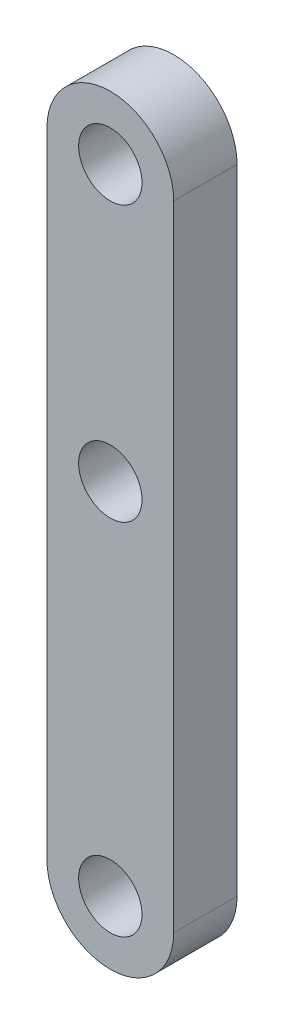
ISO-10303-21;
HEADER;
FILE_DESCRIPTION(('STEP AP214'),'2;1');
FILE_NAME('part.step','',(''),(''),'','','');
FILE_SCHEMA(('AUTOMOTIVE_DESIGN { 1 0 10303 214 1 1 1 1 }'));
ENDSEC;
DATA;
#1=APPLICATION_CONTEXT('core data for automotive mechanical design processes');
#2=APPLICATION_PROTOCOL_DEFINITION('international standard','automotive_design',2000,#1);
#3=PRODUCT_CONTEXT('',#1,'mechanical');
#4=PRODUCT('Part','Part','',(#3));
#5=PRODUCT_RELATED_PRODUCT_CATEGORY('part','',(#4));
#6=PRODUCT_DEFINITION_FORMATION('','',#4);
#7=PRODUCT_DEFINITION_CONTEXT('part definition',#1,'design');
#8=PRODUCT_DEFINITION('design','',#6,#7);
#9=PRODUCT_DEFINITION_SHAPE('','',#8);
#10=(LENGTH_UNIT() NAMED_UNIT(*) SI_UNIT(.MILLI.,.METRE.));
#11=(NAMED_UNIT(*) PLANE_ANGLE_UNIT() SI_UNIT($,.RADIAN.));
#12=(NAMED_UNIT(*) SI_UNIT($,.STERADIAN.) SOLID_ANGLE_UNIT());
#13=UNCERTAINTY_MEASURE_WITH_UNIT(LENGTH_MEASURE(1.E-05),#10,'distance_accuracy_value','');
#14=(GEOMETRIC_REPRESENTATION_CONTEXT(3) GLOBAL_UNCERTAINTY_ASSIGNED_CONTEXT((#13)) GLOBAL_UNIT_ASSIGNED_CONTEXT((#10,
#11,#12)) REPRESENTATION_CONTEXT('',''));
#15=CARTESIAN_POINT('',(0.,0.,0.));
#16=DIRECTION('',(0.,0.,1.));
#17=DIRECTION('',(1.,0.,0.));
#18=AXIS2_PLACEMENT_3D('',#15,#16,#17);
#19=CARTESIAN_POINT('',(0.,-30.,-3.));
#20=DIRECTION('',(0.,0.,1.));
#21=DIRECTION('',(-1.,0.,0.));
#22=AXIS2_PLACEMENT_3D('',#19,#20,#21);
#23=PLANE('',#22);
#24=DIRECTION('',(0.,1.,0.));
#25=VECTOR('',#24,1.);
#26=CARTESIAN_POINT('',(3.,-8.,-3.));
#27=LINE('',#26,#25);
#28=CARTESIAN_POINT('',(3.,-30.,-3.));
#29=VERTEX_POINT('',#28);
#30=CARTESIAN_POINT('',(3.,0.,-3.));
#31=VERTEX_POINT('',#30);
#32=EDGE_CURVE('E89',#29,#31,#27,.T.);
#33=ORIENTED_EDGE('',*,*,#32,.F.);
#34=CARTESIAN_POINT('',(0.,-30.,-3.));
#35=DIRECTION('',(0.,0.,1.));
#36=DIRECTION('',(-1.,0.,0.));
#37=AXIS2_PLACEMENT_3D('',#34,#35,#36);
#38=CIRCLE('',#37,3.);
#39=CARTESIAN_POINT('',(-3.,-30.,-3.));
#40=VERTEX_POINT('',#39);
#41=EDGE_CURVE('E92',#40,#29,#38,.T.);
#42=ORIENTED_EDGE('',*,*,#41,.F.);
#43=DIRECTION('',(0.,-1.,0.));
#44=VECTOR('',#43,1.);
#45=CARTESIAN_POINT('',(-3.,0.,-3.));
#46=LINE('',#45,#44);
#47=CARTESIAN_POINT('',(-3.,0.,-3.));
#48=VERTEX_POINT('',#47);
#49=EDGE_CURVE('E81',#48,#40,#46,.T.);
#50=ORIENTED_EDGE('',*,*,#49,.F.);
#51=CARTESIAN_POINT('',(0.,0.,-3.));
#52=DIRECTION('',(0.,0.,1.));
#53=DIRECTION('',(1.,0.,0.));
#54=AXIS2_PLACEMENT_3D('',#51,#52,#53);
#55=CIRCLE('',#54,3.);
#56=EDGE_CURVE('E86',#31,#48,#55,.T.);
#57=ORIENTED_EDGE('',*,*,#56,.F.);
#58=EDGE_LOOP('',(#33,#42,#50,#57));
#59=FACE_BOUND('',#58,.T.);
#60=CARTESIAN_POINT('',(0.,0.,-3.));
#61=DIRECTION('',(0.,0.,1.));
#62=DIRECTION('',(1.,0.,0.));
#63=AXIS2_PLACEMENT_3D('',#60,#61,#62);
#64=CIRCLE('',#63,1.5);
#65=CARTESIAN_POINT('',(1.5,0.,-3.));
#66=VERTEX_POINT('',#65);
#67=EDGE_CURVE('E99',#66,#66,#64,.T.);
#68=ORIENTED_EDGE('',*,*,#67,.T.);
#69=EDGE_LOOP('',(#68));
#70=FACE_BOUND('',#69,.T.);
#71=CARTESIAN_POINT('',(0.,-30.,-3.));
#72=DIRECTION('',(0.,0.,1.));
#73=DIRECTION('',(-1.,0.,0.));
#74=AXIS2_PLACEMENT_3D('',#71,#72,#73);
#75=CIRCLE('',#74,1.5);
#76=CARTESIAN_POINT('',(-1.5,-30.,-3.));
#77=VERTEX_POINT('',#76);
#78=EDGE_CURVE('E113',#77,#77,#75,.T.);
#79=ORIENTED_EDGE('',*,*,#78,.T.);
#80=EDGE_LOOP('',(#79));
#81=FACE_BOUND('',#80,.T.);
#82=CARTESIAN_POINT('',(0.,-13.,-3.));
#83=DIRECTION('',(0.,0.,1.));
#84=DIRECTION('',(1.,0.,0.));
#85=AXIS2_PLACEMENT_3D('',#82,#83,#84);
#86=CIRCLE('',#85,1.5);
#87=CARTESIAN_POINT('',(1.5,-13.,-3.));
#88=VERTEX_POINT('',#87);
#89=EDGE_CURVE('E119',#88,#88,#86,.T.);
#90=ORIENTED_EDGE('',*,*,#89,.T.);
#91=EDGE_LOOP('',(#90));
#92=FACE_BOUND('',#91,.T.);
#93=ADVANCED_FACE('F35',(#59,#70,#81,#92),#23,.F.);
#94=CARTESIAN_POINT('',(0.,-30.,0.));
#95=DIRECTION('',(0.,0.,1.));
#96=DIRECTION('',(-1.,0.,0.));
#97=AXIS2_PLACEMENT_3D('',#94,#95,#96);
#98=PLANE('',#97);
#99=CARTESIAN_POINT('',(0.,-30.,0.));
#100=DIRECTION('',(0.,0.,1.));
#101=DIRECTION('',(-1.,0.,0.));
#102=AXIS2_PLACEMENT_3D('',#99,#100,#101);
#103=CIRCLE('',#102,1.5);
#104=CARTESIAN_POINT('',(-1.5,-30.,0.));
#105=VERTEX_POINT('',#104);
#106=EDGE_CURVE('E116',#105,#105,#103,.T.);
#107=ORIENTED_EDGE('',*,*,#106,.F.);
#108=EDGE_LOOP('',(#107));
#109=FACE_BOUND('',#108,.T.);
#110=CARTESIAN_POINT('',(0.,0.,0.));
#111=DIRECTION('',(0.,0.,1.));
#112=DIRECTION('',(1.,0.,0.));
#113=AXIS2_PLACEMENT_3D('',#110,#111,#112);
#114=CIRCLE('',#113,3.);
#115=CARTESIAN_POINT('',(3.,0.,0.));
#116=VERTEX_POINT('',#115);
#117=CARTESIAN_POINT('',(-3.,0.,0.));
#118=VERTEX_POINT('',#117);
#119=EDGE_CURVE('E97',#116,#118,#114,.T.);
#120=ORIENTED_EDGE('',*,*,#119,.T.);
#121=DIRECTION('',(0.,-1.,0.));
#122=VECTOR('',#121,1.);
#123=CARTESIAN_POINT('',(-3.,0.,0.));
#124=LINE('',#123,#122);
#125=CARTESIAN_POINT('',(-3.,-30.,0.));
#126=VERTEX_POINT('',#125);
#127=EDGE_CURVE('E84',#118,#126,#124,.T.);
#128=ORIENTED_EDGE('',*,*,#127,.T.);
#129=CARTESIAN_POINT('',(0.,-30.,0.));
#130=DIRECTION('',(0.,0.,1.));
#131=DIRECTION('',(-1.,0.,0.));
#132=AXIS2_PLACEMENT_3D('',#129,#130,#131);
#133=CIRCLE('',#132,3.);
#134=CARTESIAN_POINT('',(3.,-30.,0.));
#135=VERTEX_POINT('',#134);
#136=EDGE_CURVE('E101',#126,#135,#133,.T.);
#137=ORIENTED_EDGE('',*,*,#136,.T.);
#138=DIRECTION('',(0.,1.,0.));
#139=VECTOR('',#138,1.);
#140=CARTESIAN_POINT('',(3.,-12.,0.));
#141=LINE('',#140,#139);
#142=EDGE_CURVE('E104',#135,#116,#141,.T.);
#143=ORIENTED_EDGE('',*,*,#142,.T.);
#144=EDGE_LOOP('',(#120,#128,#137,#143));
#145=FACE_BOUND('',#144,.T.);
#146=CARTESIAN_POINT('',(0.,0.,0.));
#147=DIRECTION('',(0.,0.,1.));
#148=DIRECTION('',(1.,0.,0.));
#149=AXIS2_PLACEMENT_3D('',#146,#147,#148);
#150=CIRCLE('',#149,1.5);
#151=CARTESIAN_POINT('',(1.5,0.,0.));
#152=VERTEX_POINT('',#151);
#153=EDGE_CURVE('E110',#152,#152,#150,.T.);
#154=ORIENTED_EDGE('',*,*,#153,.F.);
#155=EDGE_LOOP('',(#154));
#156=FACE_BOUND('',#155,.T.);
#157=CARTESIAN_POINT('',(0.,-13.,0.));
#158=DIRECTION('',(0.,0.,1.));
#159=DIRECTION('',(1.,0.,0.));
#160=AXIS2_PLACEMENT_3D('',#157,#158,#159);
#161=CIRCLE('',#160,1.5);
#162=CARTESIAN_POINT('',(1.5,-13.,0.));
#163=VERTEX_POINT('',#162);
#164=EDGE_CURVE('E122',#163,#163,#161,.T.);
#165=ORIENTED_EDGE('',*,*,#164,.F.);
#166=EDGE_LOOP('',(#165));
#167=FACE_BOUND('',#166,.T.);
#168=ADVANCED_FACE('F136',(#109,#145,#156,#167),#98,.T.);
#169=CARTESIAN_POINT('',(0.,0.,-3.));
#170=DIRECTION('',(0.,0.,1.));
#171=DIRECTION('',(-1.,0.,0.));
#172=AXIS2_PLACEMENT_3D('',#169,#170,#171);
#173=CYLINDRICAL_SURFACE('',#172,3.);
#174=ORIENTED_EDGE('',*,*,#119,.F.);
#175=DIRECTION('',(0.,0.,1.));
#176=VECTOR('',#175,1.);
#177=CARTESIAN_POINT('',(3.,0.,-3.));
#178=LINE('',#177,#176);
#179=EDGE_CURVE('E11',#31,#116,#178,.T.);
#180=ORIENTED_EDGE('',*,*,#179,.F.);
#181=ORIENTED_EDGE('',*,*,#56,.T.);
#182=DIRECTION('',(0.,0.,1.));
#183=VECTOR('',#182,1.);
#184=CARTESIAN_POINT('',(-3.,0.,-3.));
#185=LINE('',#184,#183);
#186=EDGE_CURVE('E44',#48,#118,#185,.T.);
#187=ORIENTED_EDGE('',*,*,#186,.T.);
#188=EDGE_LOOP('',(#174,#180,#181,#187));
#189=FACE_BOUND('',#188,.T.);
#190=ADVANCED_FACE('F37',(#189),#173,.T.);
#191=CARTESIAN_POINT('',(-3.,0.,-3.));
#192=DIRECTION('',(1.,0.,0.));
#193=DIRECTION('',(0.,1.,0.));
#194=AXIS2_PLACEMENT_3D('',#191,#192,#193);
#195=PLANE('',#194);
#196=ORIENTED_EDGE('',*,*,#127,.F.);
#197=ORIENTED_EDGE('',*,*,#186,.F.);
#198=ORIENTED_EDGE('',*,*,#49,.T.);
#199=DIRECTION('',(0.,0.,1.));
#200=VECTOR('',#199,1.);
#201=CARTESIAN_POINT('',(-3.,-30.,-3.));
#202=LINE('',#201,#200);
#203=EDGE_CURVE('E68',#40,#126,#202,.T.);
#204=ORIENTED_EDGE('',*,*,#203,.T.);
#205=EDGE_LOOP('',(#196,#197,#198,#204));
#206=FACE_BOUND('',#205,.T.);
#207=ADVANCED_FACE('F79',(#206),#195,.F.);
#208=CARTESIAN_POINT('',(0.,-30.,-3.));
#209=DIRECTION('',(0.,0.,1.));
#210=DIRECTION('',(-1.,0.,0.));
#211=AXIS2_PLACEMENT_3D('',#208,#209,#210);
#212=CYLINDRICAL_SURFACE('',#211,3.);
#213=ORIENTED_EDGE('',*,*,#136,.F.);
#214=ORIENTED_EDGE('',*,*,#203,.F.);
#215=ORIENTED_EDGE('',*,*,#41,.T.);
#216=DIRECTION('',(0.,0.,1.));
#217=VECTOR('',#216,1.);
#218=CARTESIAN_POINT('',(3.,-30.,-3.));
#219=LINE('',#218,#217);
#220=EDGE_CURVE('E52',#29,#135,#219,.T.);
#221=ORIENTED_EDGE('',*,*,#220,.T.);
#222=EDGE_LOOP('',(#213,#214,#215,#221));
#223=FACE_BOUND('',#222,.T.);
#224=ADVANCED_FACE('F152',(#223),#212,.T.);
#225=CARTESIAN_POINT('',(3.,-12.,-3.));
#226=DIRECTION('',(-1.,0.,0.));
#227=DIRECTION('',(0.,-1.,0.));
#228=AXIS2_PLACEMENT_3D('',#225,#226,#227);
#229=PLANE('',#228);
#230=ORIENTED_EDGE('',*,*,#142,.F.);
#231=ORIENTED_EDGE('',*,*,#220,.F.);
#232=ORIENTED_EDGE('',*,*,#32,.T.);
#233=ORIENTED_EDGE('',*,*,#179,.T.);
#234=EDGE_LOOP('',(#230,#231,#232,#233));
#235=FACE_BOUND('',#234,.T.);
#236=ADVANCED_FACE('F148',(#235),#229,.F.);
#237=CARTESIAN_POINT('',(0.,0.,-3.));
#238=DIRECTION('',(0.,0.,1.));
#239=DIRECTION('',(-1.,0.,0.));
#240=AXIS2_PLACEMENT_3D('',#237,#238,#239);
#241=CYLINDRICAL_SURFACE('',#240,1.5);
#242=ORIENTED_EDGE('',*,*,#67,.F.);
#243=EDGE_LOOP('',(#242));
#244=FACE_BOUND('',#243,.T.);
#245=ORIENTED_EDGE('',*,*,#153,.T.);
#246=EDGE_LOOP('',(#245));
#247=FACE_BOUND('',#246,.T.);
#248=ADVANCED_FACE('F151',(#244,#247),#241,.F.);
#249=CARTESIAN_POINT('',(0.,-30.,-3.));
#250=DIRECTION('',(0.,0.,1.));
#251=DIRECTION('',(-1.,0.,0.));
#252=AXIS2_PLACEMENT_3D('',#249,#250,#251);
#253=CYLINDRICAL_SURFACE('',#252,1.5);
#254=ORIENTED_EDGE('',*,*,#78,.F.);
#255=EDGE_LOOP('',(#254));
#256=FACE_BOUND('',#255,.T.);
#257=ORIENTED_EDGE('',*,*,#106,.T.);
#258=EDGE_LOOP('',(#257));
#259=FACE_BOUND('',#258,.T.);
#260=ADVANCED_FACE('F132',(#256,#259),#253,.F.);
#261=CARTESIAN_POINT('',(0.,-13.,-3.));
#262=DIRECTION('',(0.,0.,1.));
#263=DIRECTION('',(-1.,0.,0.));
#264=AXIS2_PLACEMENT_3D('',#261,#262,#263);
#265=CYLINDRICAL_SURFACE('',#264,1.5);
#266=ORIENTED_EDGE('',*,*,#89,.F.);
#267=EDGE_LOOP('',(#266));
#268=FACE_BOUND('',#267,.T.);
#269=ORIENTED_EDGE('',*,*,#164,.T.);
#270=EDGE_LOOP('',(#269));
#271=FACE_BOUND('',#270,.T.);
#272=ADVANCED_FACE('F129',(#268,#271),#265,.F.);
#273=CLOSED_SHELL('',(#93,#168,#190,#207,#224,#236,#248,#260,#272));
#274=MANIFOLD_SOLID_BREP('B2',#273);
#275=ADVANCED_BREP_SHAPE_REPRESENTATION('',(#18,#274),#14);
#276=SHAPE_DEFINITION_REPRESENTATION(#9,#275);
ENDSEC;
END-ISO-10303-21;
